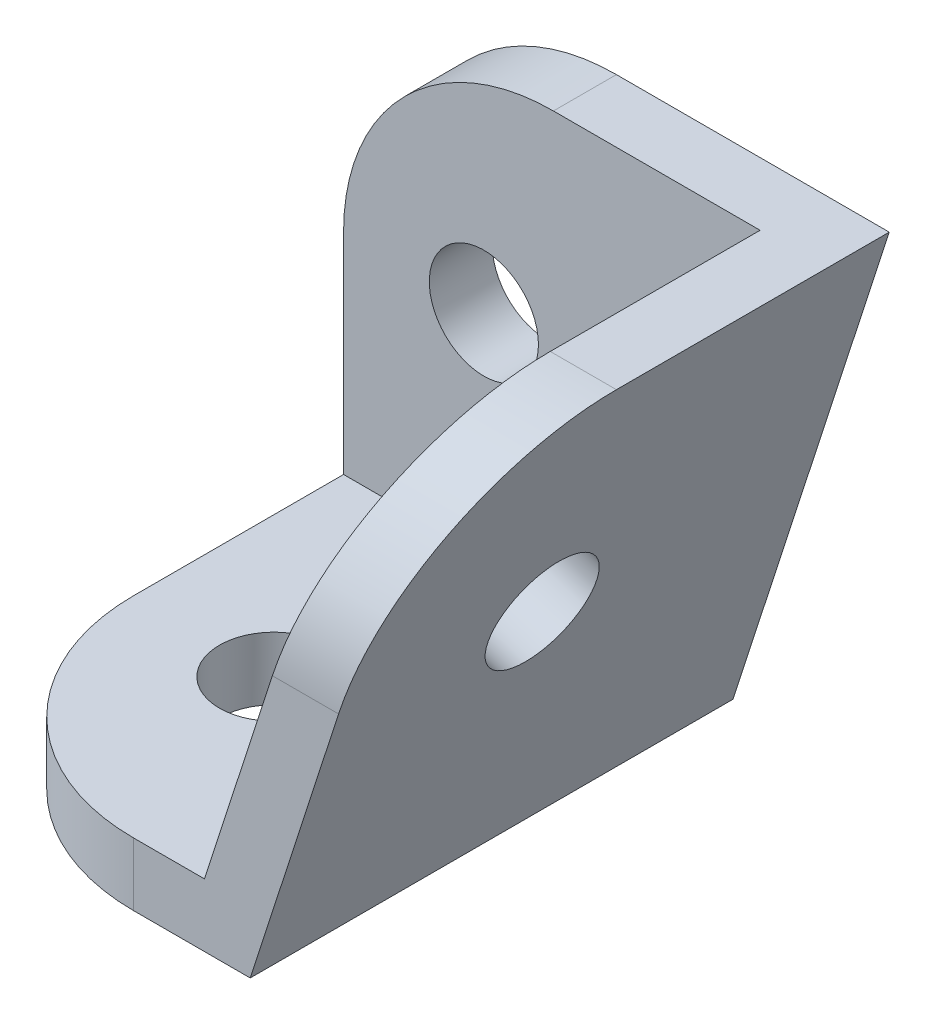
ISO-10303-21;
HEADER;
FILE_DESCRIPTION(('STEP AP214'),'2;1');
FILE_NAME('part.step','',(''),(''),'','','');
FILE_SCHEMA(('AUTOMOTIVE_DESIGN { 1 0 10303 214 1 1 1 1 }'));
ENDSEC;
DATA;
#1=APPLICATION_CONTEXT('core data for automotive mechanical design processes');
#2=APPLICATION_PROTOCOL_DEFINITION('international standard','automotive_design',2000,#1);
#3=PRODUCT_CONTEXT('',#1,'mechanical');
#4=PRODUCT('Part','Part','',(#3));
#5=PRODUCT_RELATED_PRODUCT_CATEGORY('part','',(#4));
#6=PRODUCT_DEFINITION_FORMATION('','',#4);
#7=PRODUCT_DEFINITION_CONTEXT('part definition',#1,'design');
#8=PRODUCT_DEFINITION('design','',#6,#7);
#9=PRODUCT_DEFINITION_SHAPE('','',#8);
#10=(LENGTH_UNIT() NAMED_UNIT(*) SI_UNIT(.MILLI.,.METRE.));
#11=(NAMED_UNIT(*) PLANE_ANGLE_UNIT() SI_UNIT($,.RADIAN.));
#12=(NAMED_UNIT(*) SI_UNIT($,.STERADIAN.) SOLID_ANGLE_UNIT());
#13=UNCERTAINTY_MEASURE_WITH_UNIT(LENGTH_MEASURE(1.E-05),#10,'distance_accuracy_value','');
#14=(GEOMETRIC_REPRESENTATION_CONTEXT(3) GLOBAL_UNCERTAINTY_ASSIGNED_CONTEXT((#13)) GLOBAL_UNIT_ASSIGNED_CONTEXT((#10,
#11,#12)) REPRESENTATION_CONTEXT('',''));
#15=CARTESIAN_POINT('',(0.,0.,0.));
#16=DIRECTION('',(0.,0.,1.));
#17=DIRECTION('',(1.,0.,0.));
#18=AXIS2_PLACEMENT_3D('',#15,#16,#17);
#19=CARTESIAN_POINT('',(0.,0.,3.));
#20=DIRECTION('',(0.,0.,-1.));
#21=DIRECTION('',(-1.,0.,0.));
#22=AXIS2_PLACEMENT_3D('',#19,#20,#21);
#23=PLANE('',#22);
#24=CARTESIAN_POINT('',(62.1041131228602,16.,3.));
#25=DIRECTION('',(0.,0.,1.));
#26=DIRECTION('',(1.,0.,0.));
#27=AXIS2_PLACEMENT_3D('',#24,#25,#26);
#28=CIRCLE('',#27,2.6);
#29=CARTESIAN_POINT('',(64.7041131228602,16.,3.));
#30=VERTEX_POINT('',#29);
#31=EDGE_CURVE('E194',#30,#30,#28,.T.);
#32=ORIENTED_EDGE('',*,*,#31,.F.);
#33=EDGE_LOOP('',(#32));
#34=FACE_BOUND('',#33,.T.);
#35=DIRECTION('',(-1.,0.,0.));
#36=VECTOR('',#35,1.);
#37=CARTESIAN_POINT('',(55.4187803561792,26.,3.));
#38=LINE('',#37,#36);
#39=CARTESIAN_POINT('',(75.2654307789097,26.,3.));
#40=VERTEX_POINT('',#39);
#41=CARTESIAN_POINT('',(65.4187803561792,26.,3.));
#42=VERTEX_POINT('',#41);
#43=EDGE_CURVE('E140',#40,#42,#38,.T.);
#44=ORIENTED_EDGE('',*,*,#43,.T.);
#45=CARTESIAN_POINT('',(65.4187803561792,16.,3.));
#46=DIRECTION('',(0.,0.,-1.));
#47=DIRECTION('',(-1.,0.,0.));
#48=AXIS2_PLACEMENT_3D('',#45,#46,#47);
#49=CIRCLE('',#48,10.);
#50=CARTESIAN_POINT('',(55.4187803561792,16.,3.));
#51=VERTEX_POINT('',#50);
#52=EDGE_CURVE('E13',#42,#51,#49,.F.);
#53=ORIENTED_EDGE('',*,*,#52,.T.);
#54=DIRECTION('',(0.,-1.,0.));
#55=VECTOR('',#54,1.);
#56=CARTESIAN_POINT('',(55.4187803561792,3.,3.));
#57=LINE('',#56,#55);
#58=CARTESIAN_POINT('',(55.4187803561792,6.,3.));
#59=VERTEX_POINT('',#58);
#60=EDGE_CURVE('E149',#51,#59,#57,.T.);
#61=ORIENTED_EDGE('',*,*,#60,.T.);
#62=DIRECTION('',(-1.,0.,0.));
#63=VECTOR('',#62,1.);
#64=CARTESIAN_POINT('',(55.4187803561792,6.,3.));
#65=LINE('',#64,#63);
#66=CARTESIAN_POINT('',(68.7894458895412,6.00000000000001,3.));
#67=VERTEX_POINT('',#66);
#68=EDGE_CURVE('E137',#67,#59,#65,.T.);
#69=ORIENTED_EDGE('',*,*,#68,.F.);
#70=DIRECTION('',(-0.308052662605985,-0.951369306348152,0.));
#71=VECTOR('',#70,1.);
#72=CARTESIAN_POINT('',(75.5646724371347,26.924157987818,3.));
#73=LINE('',#72,#71);
#74=EDGE_CURVE('E129',#40,#67,#73,.T.);
#75=ORIENTED_EDGE('',*,*,#74,.F.);
#76=EDGE_LOOP('',(#44,#53,#61,#69,#75));
#77=FACE_BOUND('',#76,.T.);
#78=ADVANCED_FACE('F45',(#34,#77),#23,.F.);
#79=CARTESIAN_POINT('',(60.5031410752509,-19.590871368133,0.));
#80=DIRECTION('',(-0.951369306348152,0.308052662605985,0.));
#81=DIRECTION('',(-0.308052662605985,-0.951369306348152,0.));
#82=AXIS2_PLACEMENT_3D('',#79,#80,#81);
#83=PLANE('',#82);
#84=CARTESIAN_POINT('',(72.0274383342255,16.,13.));
#85=DIRECTION('',(-0.951369306348152,0.308052662605985,0.));
#86=DIRECTION('',(-0.308052662605985,-0.951369306348152,0.));
#87=AXIS2_PLACEMENT_3D('',#84,#85,#86);
#88=CIRCLE('',#87,2.6);
#89=CARTESIAN_POINT('',(71.2265014114499,13.5264398034948,13.));
#90=VERTEX_POINT('',#89);
#91=EDGE_CURVE('E300',#90,#90,#88,.T.);
#92=ORIENTED_EDGE('',*,*,#91,.F.);
#93=EDGE_LOOP('',(#92));
#94=FACE_BOUND('',#93,.T.);
#95=DIRECTION('',(0.308052662605985,0.951369306348152,0.));
#96=VECTOR('',#95,1.);
#97=CARTESIAN_POINT('',(75.5646724371347,26.924157987818,23.));
#98=LINE('',#97,#96);
#99=CARTESIAN_POINT('',(68.7894458895412,6.,23.));
#100=VERTEX_POINT('',#99);
#101=CARTESIAN_POINT('',(72.0274383342254,16.,23.));
#102=VERTEX_POINT('',#101);
#103=EDGE_CURVE('E165',#100,#102,#98,.T.);
#104=ORIENTED_EDGE('',*,*,#103,.T.);
#105=CARTESIAN_POINT('',(72.0274383342255,16.,13.));
#106=DIRECTION('',(-0.951369306348152,0.308052662605985,0.));
#107=DIRECTION('',(0.308052662605985,0.951369306348152,0.));
#108=AXIS2_PLACEMENT_3D('',#105,#106,#107);
#109=ELLIPSE('',#108,10.5111652575646,10.);
#110=CARTESIAN_POINT('',(75.2654307789097,26.,13.));
#111=VERTEX_POINT('',#110);
#112=EDGE_CURVE('E132',#102,#111,#109,.T.);
#113=ORIENTED_EDGE('',*,*,#112,.T.);
#114=DIRECTION('',(0.,0.,1.));
#115=VECTOR('',#114,1.);
#116=CARTESIAN_POINT('',(75.2654307789097,26.,3.));
#117=LINE('',#116,#115);
#118=EDGE_CURVE('E124',#40,#111,#117,.T.);
#119=ORIENTED_EDGE('',*,*,#118,.F.);
#120=ORIENTED_EDGE('',*,*,#74,.T.);
#121=DIRECTION('',(0.,0.,1.));
#122=VECTOR('',#121,1.);
#123=CARTESIAN_POINT('',(68.7894458895412,6.,0.));
#124=LINE('',#123,#122);
#125=EDGE_CURVE('E142',#67,#100,#124,.T.);
#126=ORIENTED_EDGE('',*,*,#125,.T.);
#127=EDGE_LOOP('',(#104,#113,#119,#120,#126));
#128=FACE_BOUND('',#127,.T.);
#129=ADVANCED_FACE('F127',(#94,#128),#83,.T.);
#130=CARTESIAN_POINT('',(70.9713977334053,2.99999999999999,3.));
#131=DIRECTION('',(0.,1.,0.));
#132=DIRECTION('',(-1.,0.,0.));
#133=AXIS2_PLACEMENT_3D('',#130,#131,#132);
#134=PLANE('',#133);
#135=CARTESIAN_POINT('',(62.1041131228602,3.,13.));
#136=DIRECTION('',(0.,1.,0.));
#137=DIRECTION('',(-1.,0.,0.));
#138=AXIS2_PLACEMENT_3D('',#135,#136,#137);
#139=CIRCLE('',#138,2.6);
#140=CARTESIAN_POINT('',(59.5041131228602,3.,13.));
#141=VERTEX_POINT('',#140);
#142=EDGE_CURVE('E198',#141,#141,#139,.T.);
#143=ORIENTED_EDGE('',*,*,#142,.T.);
#144=EDGE_LOOP('',(#143));
#145=FACE_BOUND('',#144,.T.);
#146=DIRECTION('',(-1.,0.,0.));
#147=VECTOR('',#146,1.);
#148=CARTESIAN_POINT('',(55.4187803561792,3.,23.));
#149=LINE('',#148,#147);
#150=CARTESIAN_POINT('',(70.9713977334052,3.00000000000001,23.));
#151=VERTEX_POINT('',#150);
#152=CARTESIAN_POINT('',(65.4187803561792,2.99999999999999,23.));
#153=VERTEX_POINT('',#152);
#154=EDGE_CURVE('E207',#151,#153,#149,.T.);
#155=ORIENTED_EDGE('',*,*,#154,.T.);
#156=CARTESIAN_POINT('',(65.4187803561792,2.99999999999999,13.));
#157=DIRECTION('',(0.,1.,0.));
#158=DIRECTION('',(-1.,0.,0.));
#159=AXIS2_PLACEMENT_3D('',#156,#157,#158);
#160=CIRCLE('',#159,10.);
#161=CARTESIAN_POINT('',(55.4187803561792,3.,13.));
#162=VERTEX_POINT('',#161);
#163=EDGE_CURVE('E191',#153,#162,#160,.F.);
#164=ORIENTED_EDGE('',*,*,#163,.T.);
#165=DIRECTION('',(0.,0.,-1.));
#166=VECTOR('',#165,1.);
#167=CARTESIAN_POINT('',(55.4187803561792,3.,3.));
#168=LINE('',#167,#166);
#169=CARTESIAN_POINT('',(55.4187803561792,3.,0.));
#170=VERTEX_POINT('',#169);
#171=EDGE_CURVE('E152',#162,#170,#168,.T.);
#172=ORIENTED_EDGE('',*,*,#171,.T.);
#173=DIRECTION('',(1.,0.,0.));
#174=VECTOR('',#173,1.);
#175=CARTESIAN_POINT('',(70.9713977334053,2.99999999999999,0.));
#176=LINE('',#175,#174);
#177=CARTESIAN_POINT('',(70.9713977334053,2.99999999999999,0.));
#178=VERTEX_POINT('',#177);
#179=EDGE_CURVE('E161',#170,#178,#176,.T.);
#180=ORIENTED_EDGE('',*,*,#179,.T.);
#181=DIRECTION('',(0.,0.,-1.));
#182=VECTOR('',#181,1.);
#183=CARTESIAN_POINT('',(70.9713977334053,2.99999999999999,3.));
#184=LINE('',#183,#182);
#185=EDGE_CURVE('E143',#151,#178,#184,.T.);
#186=ORIENTED_EDGE('',*,*,#185,.F.);
#187=EDGE_LOOP('',(#155,#164,#172,#180,#186));
#188=FACE_BOUND('',#187,.T.);
#189=ADVANCED_FACE('F238',(#145,#188),#134,.F.);
#190=CARTESIAN_POINT('',(78.4187803561792,26.,3.));
#191=DIRECTION('',(-0.951369306348152,0.308052662605985,0.));
#192=DIRECTION('',(-0.308052662605985,-0.951369306348152,0.));
#193=AXIS2_PLACEMENT_3D('',#190,#191,#192);
#194=PLANE('',#193);
#195=CARTESIAN_POINT('',(74.88154625327,15.075842012182,13.));
#196=DIRECTION('',(-0.951369306348152,0.308052662605985,0.));
#197=DIRECTION('',(-0.308052662605985,-0.951369306348152,0.));
#198=AXIS2_PLACEMENT_3D('',#195,#196,#197);
#199=CIRCLE('',#198,2.6);
#200=CARTESIAN_POINT('',(74.0806093304944,12.6022818156769,13.));
#201=VERTEX_POINT('',#200);
#202=EDGE_CURVE('E49',#201,#201,#199,.T.);
#203=ORIENTED_EDGE('',*,*,#202,.T.);
#204=EDGE_LOOP('',(#203));
#205=FACE_BOUND('',#204,.T.);
#206=DIRECTION('',(0.,0.,-1.));
#207=VECTOR('',#206,1.);
#208=CARTESIAN_POINT('',(78.4187803561792,26.,3.));
#209=LINE('',#208,#207);
#210=CARTESIAN_POINT('',(78.4187803561792,26.,13.));
#211=VERTEX_POINT('',#210);
#212=CARTESIAN_POINT('',(78.4187803561792,26.,0.));
#213=VERTEX_POINT('',#212);
#214=EDGE_CURVE('E170',#211,#213,#209,.T.);
#215=ORIENTED_EDGE('',*,*,#214,.F.);
#216=CARTESIAN_POINT('',(75.1807879114949,16.,13.));
#217=DIRECTION('',(-0.951369306348152,0.308052662605985,0.));
#218=DIRECTION('',(0.308052662605985,0.951369306348152,0.));
#219=AXIS2_PLACEMENT_3D('',#216,#217,#218);
#220=ELLIPSE('',#219,10.5111652575646,10.);
#221=CARTESIAN_POINT('',(75.1807879114948,16.,23.));
#222=VERTEX_POINT('',#221);
#223=EDGE_CURVE('E178',#211,#222,#220,.F.);
#224=ORIENTED_EDGE('',*,*,#223,.T.);
#225=DIRECTION('',(0.308052662605985,0.951369306348152,0.));
#226=VECTOR('',#225,1.);
#227=CARTESIAN_POINT('',(78.4187803561791,26.,23.));
#228=LINE('',#227,#226);
#229=EDGE_CURVE('E158',#151,#222,#228,.T.);
#230=ORIENTED_EDGE('',*,*,#229,.F.);
#231=ORIENTED_EDGE('',*,*,#185,.T.);
#232=DIRECTION('',(0.308052662605985,0.951369306348152,0.));
#233=VECTOR('',#232,1.);
#234=CARTESIAN_POINT('',(78.4187803561792,26.,0.));
#235=LINE('',#234,#233);
#236=EDGE_CURVE('E164',#178,#213,#235,.T.);
#237=ORIENTED_EDGE('',*,*,#236,.T.);
#238=EDGE_LOOP('',(#215,#224,#230,#231,#237));
#239=FACE_BOUND('',#238,.T.);
#240=ADVANCED_FACE('F226',(#205,#239),#194,.F.);
#241=CARTESIAN_POINT('',(55.4187803561792,26.,3.));
#242=DIRECTION('',(0.,-1.,0.));
#243=DIRECTION('',(0.,0.,-1.));
#244=AXIS2_PLACEMENT_3D('',#241,#242,#243);
#245=PLANE('',#244);
#246=ORIENTED_EDGE('',*,*,#118,.T.);
#247=DIRECTION('',(1.,0.,0.));
#248=VECTOR('',#247,1.);
#249=CARTESIAN_POINT('',(55.4187803561792,26.,13.));
#250=LINE('',#249,#248);
#251=EDGE_CURVE('E176',#111,#211,#250,.T.);
#252=ORIENTED_EDGE('',*,*,#251,.T.);
#253=ORIENTED_EDGE('',*,*,#214,.T.);
#254=DIRECTION('',(-1.,0.,0.));
#255=VECTOR('',#254,1.);
#256=CARTESIAN_POINT('',(55.4187803561792,26.,0.));
#257=LINE('',#256,#255);
#258=CARTESIAN_POINT('',(65.4187803561792,26.,0.));
#259=VERTEX_POINT('',#258);
#260=EDGE_CURVE('E155',#213,#259,#257,.T.);
#261=ORIENTED_EDGE('',*,*,#260,.T.);
#262=DIRECTION('',(0.,0.,-1.));
#263=VECTOR('',#262,1.);
#264=CARTESIAN_POINT('',(65.4187803561792,26.,3.));
#265=LINE('',#264,#263);
#266=EDGE_CURVE('E148',#259,#42,#265,.F.);
#267=ORIENTED_EDGE('',*,*,#266,.T.);
#268=ORIENTED_EDGE('',*,*,#43,.F.);
#269=EDGE_LOOP('',(#246,#252,#253,#261,#267,#268));
#270=FACE_BOUND('',#269,.T.);
#271=ADVANCED_FACE('F145',(#270),#245,.F.);
#272=CARTESIAN_POINT('',(55.4187803561792,3.,3.));
#273=DIRECTION('',(1.,0.,0.));
#274=DIRECTION('',(0.,0.,-1.));
#275=AXIS2_PLACEMENT_3D('',#272,#273,#274);
#276=PLANE('',#275);
#277=ORIENTED_EDGE('',*,*,#171,.F.);
#278=DIRECTION('',(0.,1.,0.));
#279=VECTOR('',#278,1.);
#280=CARTESIAN_POINT('',(55.4187803561792,3.,13.));
#281=LINE('',#280,#279);
#282=CARTESIAN_POINT('',(55.4187803561792,6.,13.));
#283=VERTEX_POINT('',#282);
#284=EDGE_CURVE('E188',#162,#283,#281,.T.);
#285=ORIENTED_EDGE('',*,*,#284,.T.);
#286=DIRECTION('',(0.,0.,-1.));
#287=VECTOR('',#286,1.);
#288=CARTESIAN_POINT('',(55.4187803561792,6.,38.8393152403251));
#289=LINE('',#288,#287);
#290=EDGE_CURVE('E212',#283,#59,#289,.T.);
#291=ORIENTED_EDGE('',*,*,#290,.T.);
#292=ORIENTED_EDGE('',*,*,#60,.F.);
#293=DIRECTION('',(0.,0.,-1.));
#294=VECTOR('',#293,1.);
#295=CARTESIAN_POINT('',(55.4187803561792,16.,3.));
#296=LINE('',#295,#294);
#297=CARTESIAN_POINT('',(55.4187803561792,16.,0.));
#298=VERTEX_POINT('',#297);
#299=EDGE_CURVE('E185',#51,#298,#296,.T.);
#300=ORIENTED_EDGE('',*,*,#299,.T.);
#301=DIRECTION('',(0.,-1.,0.));
#302=VECTOR('',#301,1.);
#303=CARTESIAN_POINT('',(55.4187803561792,3.,0.));
#304=LINE('',#303,#302);
#305=EDGE_CURVE('E150',#298,#170,#304,.T.);
#306=ORIENTED_EDGE('',*,*,#305,.T.);
#307=EDGE_LOOP('',(#277,#285,#291,#292,#300,#306));
#308=FACE_BOUND('',#307,.T.);
#309=ADVANCED_FACE('F236',(#308),#276,.F.);
#310=CARTESIAN_POINT('',(0.,0.,0.));
#311=DIRECTION('',(0.,0.,-1.));
#312=DIRECTION('',(-1.,0.,0.));
#313=AXIS2_PLACEMENT_3D('',#310,#311,#312);
#314=PLANE('',#313);
#315=CARTESIAN_POINT('',(62.1041131228602,16.,0.));
#316=DIRECTION('',(0.,0.,-1.));
#317=DIRECTION('',(-1.,0.,0.));
#318=AXIS2_PLACEMENT_3D('',#315,#316,#317);
#319=CIRCLE('',#318,2.6);
#320=CARTESIAN_POINT('',(59.5041131228602,16.,0.));
#321=VERTEX_POINT('',#320);
#322=EDGE_CURVE('E138',#321,#321,#319,.T.);
#323=ORIENTED_EDGE('',*,*,#322,.F.);
#324=EDGE_LOOP('',(#323));
#325=FACE_BOUND('',#324,.T.);
#326=ORIENTED_EDGE('',*,*,#305,.F.);
#327=CARTESIAN_POINT('',(65.4187803561792,16.,0.));
#328=DIRECTION('',(0.,0.,-1.));
#329=DIRECTION('',(-1.,0.,0.));
#330=AXIS2_PLACEMENT_3D('',#327,#328,#329);
#331=CIRCLE('',#330,10.);
#332=EDGE_CURVE('E54',#298,#259,#331,.T.);
#333=ORIENTED_EDGE('',*,*,#332,.T.);
#334=ORIENTED_EDGE('',*,*,#260,.F.);
#335=ORIENTED_EDGE('',*,*,#236,.F.);
#336=ORIENTED_EDGE('',*,*,#179,.F.);
#337=EDGE_LOOP('',(#326,#333,#334,#335,#336));
#338=FACE_BOUND('',#337,.T.);
#339=ADVANCED_FACE('F231',(#325,#338),#314,.T.);
#340=CARTESIAN_POINT('',(75.5646724371347,26.924157987818,23.));
#341=DIRECTION('',(0.,0.,-1.));
#342=DIRECTION('',(-1.,0.,0.));
#343=AXIS2_PLACEMENT_3D('',#340,#341,#342);
#344=PLANE('',#343);
#345=ORIENTED_EDGE('',*,*,#229,.T.);
#346=DIRECTION('',(1.,0.,0.));
#347=VECTOR('',#346,1.);
#348=CARTESIAN_POINT('',(75.5646724371347,16.,23.));
#349=LINE('',#348,#347);
#350=EDGE_CURVE('E182',#222,#102,#349,.F.);
#351=ORIENTED_EDGE('',*,*,#350,.T.);
#352=ORIENTED_EDGE('',*,*,#103,.F.);
#353=DIRECTION('',(1.,0.,0.));
#354=VECTOR('',#353,1.);
#355=CARTESIAN_POINT('',(55.4187803561792,6.,23.));
#356=LINE('',#355,#354);
#357=CARTESIAN_POINT('',(65.4187803561792,6.,23.));
#358=VERTEX_POINT('',#357);
#359=EDGE_CURVE('E210',#358,#100,#356,.T.);
#360=ORIENTED_EDGE('',*,*,#359,.F.);
#361=DIRECTION('',(0.,1.,0.));
#362=VECTOR('',#361,1.);
#363=CARTESIAN_POINT('',(65.4187803561792,26.924157987818,23.));
#364=LINE('',#363,#362);
#365=EDGE_CURVE('E180',#358,#153,#364,.F.);
#366=ORIENTED_EDGE('',*,*,#365,.T.);
#367=ORIENTED_EDGE('',*,*,#154,.F.);
#368=EDGE_LOOP('',(#345,#351,#352,#360,#366,#367));
#369=FACE_BOUND('',#368,.T.);
#370=ADVANCED_FACE('F221',(#369),#344,.F.);
#371=CARTESIAN_POINT('',(55.4187803561792,6.,38.8393152403251));
#372=DIRECTION('',(0.,-1.,0.));
#373=DIRECTION('',(0.,0.,-1.));
#374=AXIS2_PLACEMENT_3D('',#371,#372,#373);
#375=PLANE('',#374);
#376=CARTESIAN_POINT('',(62.1041131228602,6.,13.));
#377=DIRECTION('',(0.,1.,0.));
#378=DIRECTION('',(0.,0.,1.));
#379=AXIS2_PLACEMENT_3D('',#376,#377,#378);
#380=CIRCLE('',#379,2.6);
#381=CARTESIAN_POINT('',(62.1041131228602,6.,15.6));
#382=VERTEX_POINT('',#381);
#383=EDGE_CURVE('E203',#382,#382,#380,.T.);
#384=ORIENTED_EDGE('',*,*,#383,.F.);
#385=EDGE_LOOP('',(#384));
#386=FACE_BOUND('',#385,.T.);
#387=ORIENTED_EDGE('',*,*,#290,.F.);
#388=CARTESIAN_POINT('',(65.4187803561792,6.,13.));
#389=DIRECTION('',(0.,-1.,0.));
#390=DIRECTION('',(0.,0.,-1.));
#391=AXIS2_PLACEMENT_3D('',#388,#389,#390);
#392=CIRCLE('',#391,10.);
#393=EDGE_CURVE('E68',#283,#358,#392,.F.);
#394=ORIENTED_EDGE('',*,*,#393,.T.);
#395=ORIENTED_EDGE('',*,*,#359,.T.);
#396=ORIENTED_EDGE('',*,*,#125,.F.);
#397=ORIENTED_EDGE('',*,*,#68,.T.);
#398=EDGE_LOOP('',(#387,#394,#395,#396,#397));
#399=FACE_BOUND('',#398,.T.);
#400=ADVANCED_FACE('F244',(#386,#399),#375,.F.);
#401=CARTESIAN_POINT('',(55.4187803561792,16.,13.));
#402=DIRECTION('',(1.,0.,0.));
#403=DIRECTION('',(0.,0.,-1.));
#404=AXIS2_PLACEMENT_3D('',#401,#402,#403);
#405=CYLINDRICAL_SURFACE('',#404,10.);
#406=ORIENTED_EDGE('',*,*,#112,.F.);
#407=ORIENTED_EDGE('',*,*,#350,.F.);
#408=ORIENTED_EDGE('',*,*,#223,.F.);
#409=ORIENTED_EDGE('',*,*,#251,.F.);
#410=EDGE_LOOP('',(#406,#407,#408,#409));
#411=FACE_BOUND('',#410,.T.);
#412=ADVANCED_FACE('F224',(#411),#405,.T.);
#413=CARTESIAN_POINT('',(65.4187803561792,3.,13.));
#414=DIRECTION('',(0.,1.,0.));
#415=DIRECTION('',(0.,0.,1.));
#416=AXIS2_PLACEMENT_3D('',#413,#414,#415);
#417=CYLINDRICAL_SURFACE('',#416,10.);
#418=ORIENTED_EDGE('',*,*,#163,.F.);
#419=ORIENTED_EDGE('',*,*,#365,.F.);
#420=ORIENTED_EDGE('',*,*,#393,.F.);
#421=ORIENTED_EDGE('',*,*,#284,.F.);
#422=EDGE_LOOP('',(#418,#419,#420,#421));
#423=FACE_BOUND('',#422,.T.);
#424=ADVANCED_FACE('F241',(#423),#417,.T.);
#425=CARTESIAN_POINT('',(65.4187803561792,16.,3.));
#426=DIRECTION('',(0.,0.,-1.));
#427=DIRECTION('',(-1.,0.,0.));
#428=AXIS2_PLACEMENT_3D('',#425,#426,#427);
#429=CYLINDRICAL_SURFACE('',#428,10.);
#430=ORIENTED_EDGE('',*,*,#52,.F.);
#431=ORIENTED_EDGE('',*,*,#266,.F.);
#432=ORIENTED_EDGE('',*,*,#332,.F.);
#433=ORIENTED_EDGE('',*,*,#299,.F.);
#434=EDGE_LOOP('',(#430,#431,#432,#433));
#435=FACE_BOUND('',#434,.T.);
#436=ADVANCED_FACE('F47',(#435),#429,.T.);
#437=CARTESIAN_POINT('',(62.1041131228602,16.,-17.));
#438=DIRECTION('',(0.,0.,1.));
#439=DIRECTION('',(1.,0.,0.));
#440=AXIS2_PLACEMENT_3D('',#437,#438,#439);
#441=CYLINDRICAL_SURFACE('',#440,2.6);
#442=ORIENTED_EDGE('',*,*,#322,.T.);
#443=EDGE_LOOP('',(#442));
#444=FACE_BOUND('',#443,.T.);
#445=ORIENTED_EDGE('',*,*,#31,.T.);
#446=EDGE_LOOP('',(#445));
#447=FACE_BOUND('',#446,.T.);
#448=ADVANCED_FACE('F281',(#444,#447),#441,.F.);
#449=CARTESIAN_POINT('',(62.1041131228602,-14.,13.));
#450=DIRECTION('',(0.,1.,0.));
#451=DIRECTION('',(0.,0.,1.));
#452=AXIS2_PLACEMENT_3D('',#449,#450,#451);
#453=CYLINDRICAL_SURFACE('',#452,2.6);
#454=ORIENTED_EDGE('',*,*,#383,.T.);
#455=EDGE_LOOP('',(#454));
#456=FACE_BOUND('',#455,.T.);
#457=ORIENTED_EDGE('',*,*,#142,.F.);
#458=EDGE_LOOP('',(#457));
#459=FACE_BOUND('',#458,.T.);
#460=ADVANCED_FACE('F285',(#456,#459),#453,.F.);
#461=CARTESIAN_POINT('',(91.0548244611885,9.83894674788031,13.));
#462=DIRECTION('',(-0.951369306348152,0.308052662605985,0.));
#463=DIRECTION('',(-0.308052662605985,-0.951369306348152,0.));
#464=AXIS2_PLACEMENT_3D('',#461,#462,#463);
#465=CYLINDRICAL_SURFACE('',#464,2.6);
#466=ORIENTED_EDGE('',*,*,#91,.T.);
#467=EDGE_LOOP('',(#466));
#468=FACE_BOUND('',#467,.T.);
#469=ORIENTED_EDGE('',*,*,#202,.F.);
#470=EDGE_LOOP('',(#469));
#471=FACE_BOUND('',#470,.T.);
#472=ADVANCED_FACE('F289',(#468,#471),#465,.F.);
#473=CLOSED_SHELL('',(#78,#129,#189,#240,#271,#309,#339,#370,#400,#412,#424,#436,#448,#460,#472));
#474=MANIFOLD_SOLID_BREP('B2',#473);
#475=ADVANCED_BREP_SHAPE_REPRESENTATION('',(#18,#474),#14);
#476=SHAPE_DEFINITION_REPRESENTATION(#9,#475);
ENDSEC;
END-ISO-10303-21;
